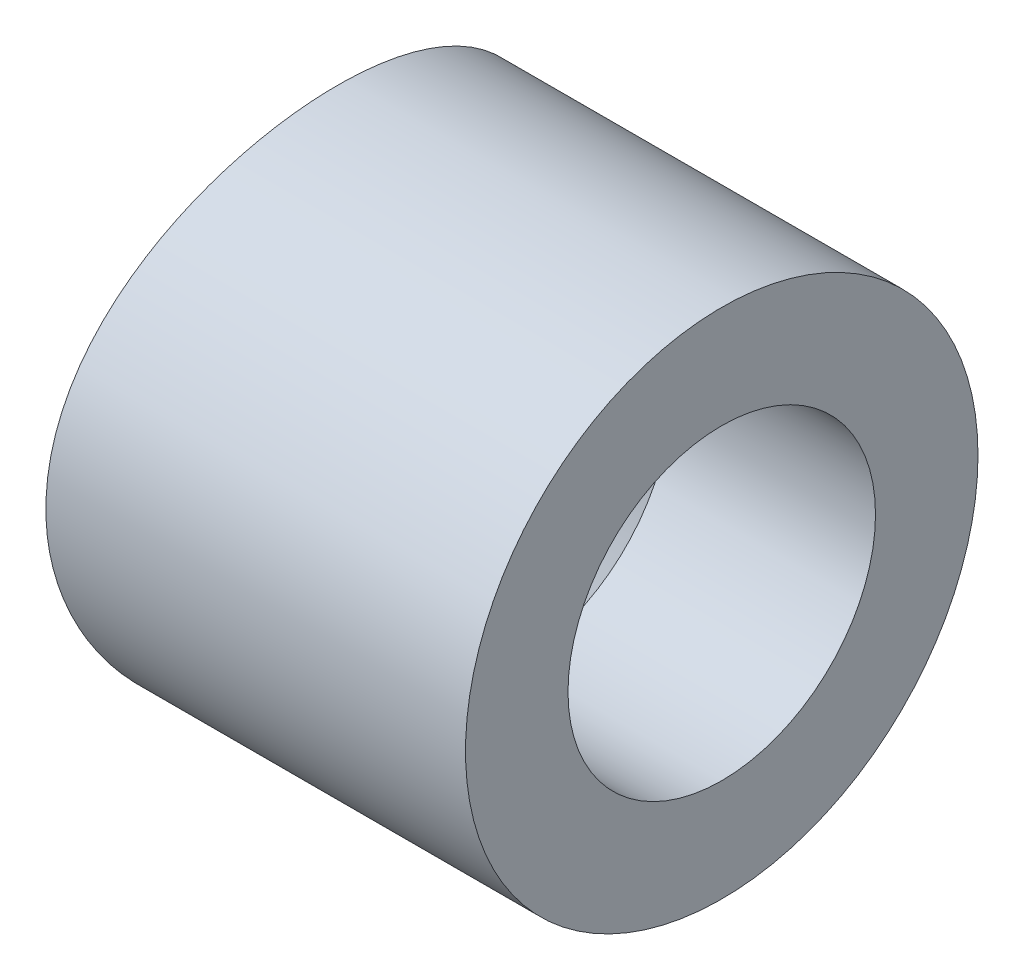
ISO-10303-21;
HEADER;
FILE_DESCRIPTION(('STEP AP214'),'2;1');
FILE_NAME('part.step','',(''),(''),'','','');
FILE_SCHEMA(('AUTOMOTIVE_DESIGN { 1 0 10303 214 1 1 1 1 }'));
ENDSEC;
DATA;
#1=APPLICATION_CONTEXT('core data for automotive mechanical design processes');
#2=APPLICATION_PROTOCOL_DEFINITION('international standard','automotive_design',2000,#1);
#3=PRODUCT_CONTEXT('',#1,'mechanical');
#4=PRODUCT('Part','Part','',(#3));
#5=PRODUCT_RELATED_PRODUCT_CATEGORY('part','',(#4));
#6=PRODUCT_DEFINITION_FORMATION('','',#4);
#7=PRODUCT_DEFINITION_CONTEXT('part definition',#1,'design');
#8=PRODUCT_DEFINITION('design','',#6,#7);
#9=PRODUCT_DEFINITION_SHAPE('','',#8);
#10=(LENGTH_UNIT() NAMED_UNIT(*) SI_UNIT(.MILLI.,.METRE.));
#11=(NAMED_UNIT(*) PLANE_ANGLE_UNIT() SI_UNIT($,.RADIAN.));
#12=(NAMED_UNIT(*) SI_UNIT($,.STERADIAN.) SOLID_ANGLE_UNIT());
#13=UNCERTAINTY_MEASURE_WITH_UNIT(LENGTH_MEASURE(1.E-05),#10,'distance_accuracy_value','');
#14=(GEOMETRIC_REPRESENTATION_CONTEXT(3) GLOBAL_UNCERTAINTY_ASSIGNED_CONTEXT((#13)) GLOBAL_UNIT_ASSIGNED_CONTEXT((#10,
#11,#12)) REPRESENTATION_CONTEXT('',''));
#15=CARTESIAN_POINT('',(0.,0.,0.));
#16=DIRECTION('',(0.,0.,1.));
#17=DIRECTION('',(1.,0.,0.));
#18=AXIS2_PLACEMENT_3D('',#15,#16,#17);
#19=CARTESIAN_POINT('',(-23.496,37.084,0.));
#20=DIRECTION('',(1.,0.,0.));
#21=DIRECTION('',(0.,0.,-1.));
#22=AXIS2_PLACEMENT_3D('',#19,#20,#21);
#23=CYLINDRICAL_SURFACE('',#22,6.35);
#24=CARTESIAN_POINT('',(33.02,37.084,0.));
#25=DIRECTION('',(1.,0.,0.));
#26=DIRECTION('',(0.,0.,-1.));
#27=AXIS2_PLACEMENT_3D('',#24,#25,#26);
#28=CIRCLE('',#27,6.35);
#29=CARTESIAN_POINT('',(33.02,37.084,-6.35));
#30=VERTEX_POINT('',#29);
#31=EDGE_CURVE('E50',#30,#30,#28,.T.);
#32=ORIENTED_EDGE('',*,*,#31,.F.);
#33=EDGE_LOOP('',(#32));
#34=FACE_BOUND('',#33,.T.);
#35=CARTESIAN_POINT('',(22.6206216758072,37.084,-6.35));
#36=CARTESIAN_POINT('',(22.6206171447665,36.9091350857843,-6.35000625183314));
#37=CARTESIAN_POINT('',(22.6226525124081,36.7343339108501,-6.34277620260016));
#38=CARTESIAN_POINT('',(22.6307205536991,36.385966778141,-6.31393451339641));
#39=CARTESIAN_POINT('',(22.6367535820083,36.2124009313415,-6.29232159742277));
#40=CARTESIAN_POINT('',(22.6526389586718,35.8677828132679,-6.23488971599179));
#41=CARTESIAN_POINT('',(22.6624921997348,35.6967311392106,-6.1990674300382));
#42=CARTESIAN_POINT('',(22.6857221381915,35.3583211202099,-6.11350973181226));
#43=CARTESIAN_POINT('',(22.6991001423121,35.1909641699923,-6.06376915922187));
#44=CARTESIAN_POINT('',(22.7289530882356,34.8614653490296,-5.95089187260937));
#45=CARTESIAN_POINT('',(22.7454223073816,34.6993144798505,-5.88777988524634));
#46=CARTESIAN_POINT('',(22.7810037447017,34.3809189100622,-5.74856966802378));
#47=CARTESIAN_POINT('',(22.8001169399521,34.2246764201898,-5.67246663490336));
#48=CARTESIAN_POINT('',(22.8404359088864,33.9192083478952,-5.50787484804411));
#49=CARTESIAN_POINT('',(22.8616410174571,33.7699805573232,-5.41939002731091));
#50=CARTESIAN_POINT('',(22.9055734442173,33.4793620884262,-5.23059496890694));
#51=CARTESIAN_POINT('',(22.9283013352139,33.3379743961835,-5.13028027042319));
#52=CARTESIAN_POINT('',(22.9751902852028,33.0608266348819,-4.91609036852589));
#53=CARTESIAN_POINT('',(22.9993722290803,32.9252690933813,-4.80195759900939));
#54=CARTESIAN_POINT('',(23.04801988654,32.6641400751404,-4.56275165173534));
#55=CARTESIAN_POINT('',(23.0724857021796,32.5385723259584,-4.43767442641537));
#56=CARTESIAN_POINT('',(23.1210162383246,32.2983226211764,-4.17745636161245));
#57=CARTESIAN_POINT('',(23.1450810604961,32.1836378706331,-4.04231812196956));
#58=CARTESIAN_POINT('',(23.1921697595213,31.9658435981473,-3.76276268759905));
#59=CARTESIAN_POINT('',(23.2151932496691,31.8627383555944,-3.61834209323056));
#60=CARTESIAN_POINT('',(23.2599258271824,31.667282714613,-3.3187619604962));
#61=CARTESIAN_POINT('',(23.281607256166,31.5751358104311,-3.16346540886465));
#62=CARTESIAN_POINT('',(23.3226233524335,31.4042891856671,-2.84534390597261));
#63=CARTESIAN_POINT('',(23.3419580147118,31.3255894937676,-2.68251893865507));
#64=CARTESIAN_POINT('',(23.3777254753196,31.1822764857297,-2.35049950220789));
#65=CARTESIAN_POINT('',(23.3941586781444,31.1176612057755,-2.18130592492826));
#66=CARTESIAN_POINT('',(23.4236510412526,31.0030483552305,-1.8377478291965));
#67=CARTESIAN_POINT('',(23.4367102157954,30.9530507228618,-1.66338333260143));
#68=CARTESIAN_POINT('',(23.4588093016421,30.8691138769165,-1.31493269979184));
#69=CARTESIAN_POINT('',(23.4679364534586,30.834824902674,-1.14093631433375));
#70=CARTESIAN_POINT('',(23.4823514106066,30.7809071541106,-0.790531904885671));
#71=CARTESIAN_POINT('',(23.4876393360399,30.7612779211911,-0.614123956512077));
#72=CARTESIAN_POINT('',(23.4942252191217,30.736856370076,-0.260234621725184));
#73=CARTESIAN_POINT('',(23.4955237400356,30.7320619573465,-0.0827533903948831));
#74=CARTESIAN_POINT('',(23.4940952959307,30.7373476820962,0.271969813521479));
#75=CARTESIAN_POINT('',(23.4913683849501,30.7474276198993,0.449211789287382));
#76=CARTESIAN_POINT('',(23.4820900623918,30.7819134780304,0.797512944806933));
#77=CARTESIAN_POINT('',(23.475640391305,30.8059383861873,0.968612707411062));
#78=CARTESIAN_POINT('',(23.4591690532612,30.8678134332904,1.30817503191727));
#79=CARTESIAN_POINT('',(23.4491461832945,30.9056682285319,1.47663668566684));
#80=CARTESIAN_POINT('',(23.4257975849334,30.994884878971,1.80966012873609));
#81=CARTESIAN_POINT('',(23.4124729269454,31.0462423570632,1.97422316304331));
#82=CARTESIAN_POINT('',(23.382875248232,31.1620540169932,2.29842112552168));
#83=CARTESIAN_POINT('',(23.3666011190504,31.2265131237326,2.45805417444132));
#84=CARTESIAN_POINT('',(23.3136242170923,31.4402532578568,2.93101382941278));
#85=CARTESIAN_POINT('',(23.2729922155807,31.6090756866499,3.23534384085546));
#86=CARTESIAN_POINT('',(23.1855836987682,31.9934533857542,3.81169980654757));
#87=CARTESIAN_POINT('',(23.1388059584488,32.2090179786794,4.08371929976479));
#88=CARTESIAN_POINT('',(23.042416504419,32.6888549836736,4.59699829564012));
#89=CARTESIAN_POINT('',(22.9927619371408,32.9544482251612,4.83701836482751));
#90=CARTESIAN_POINT('',(22.8975450373185,33.5226367341493,5.26940661322532));
#91=CARTESIAN_POINT('',(22.8519829686413,33.8252343845709,5.46177172124997));
#92=CARTESIAN_POINT('',(22.7699315305126,34.4615254462129,5.79438303780041));
#93=CARTESIAN_POINT('',(22.733502900187,34.7954077498074,5.93428324132677));
#94=CARTESIAN_POINT('',(22.6746013096901,35.4833984759042,6.15555430640536));
#95=CARTESIAN_POINT('',(22.6521247801952,35.8375017000155,6.23694013835529));
#96=CARTESIAN_POINT('',(22.6312203075726,36.369759207795,6.3121591421817));
#97=CARTESIAN_POINT('',(22.6263688748414,36.5446509016681,6.32949556878163));
#98=CARTESIAN_POINT('',(22.620731894457,36.8953188047965,6.34962001312429));
#99=CARTESIAN_POINT('',(22.6199447976745,37.0710946514808,6.35241357391038));
#100=CARTESIAN_POINT('',(22.622468337673,37.4222456562169,6.34341856455059));
#101=CARTESIAN_POINT('',(22.6257793475858,37.597620776326,6.33162866658364));
#102=CARTESIAN_POINT('',(22.6363933264572,37.9466695901215,6.29357726550313));
#103=CARTESIAN_POINT('',(22.6436961839065,38.120343331197,6.2673161666323));
#104=CARTESIAN_POINT('',(22.6618853956957,38.4612916112609,6.20121936943715));
#105=CARTESIAN_POINT('',(22.6726974643518,38.6286247068848,6.16166451508441));
#106=CARTESIAN_POINT('',(22.6976235186319,38.9593060074918,6.06920110877371));
#107=CARTESIAN_POINT('',(22.7117375093495,39.1226542063271,6.01629253621541));
#108=CARTESIAN_POINT('',(22.7428680709748,39.444330712719,5.89752010648172));
#109=CARTESIAN_POINT('',(22.7598854028959,39.6026576911947,5.83165285192726));
#110=CARTESIAN_POINT('',(22.7963388161685,39.9131890806151,5.68748491560442));
#111=CARTESIAN_POINT('',(22.8157741193291,40.0653954406364,5.60918823184984));
#112=CARTESIAN_POINT('',(22.857005031795,40.366203112449,5.43876851988416));
#113=CARTESIAN_POINT('',(22.8788444154387,40.5146426577641,5.34637051707005));
#114=CARTESIAN_POINT('',(22.9238904168971,40.803211754628,5.14979935026711));
#115=CARTESIAN_POINT('',(22.9470965809447,40.9433440335074,5.04563008387021));
#116=CARTESIAN_POINT('',(22.9942638400063,41.2145556727926,4.82612268304971));
#117=CARTESIAN_POINT('',(23.0182253212322,41.3456302887622,4.71077877015227));
#118=CARTESIAN_POINT('',(23.0662411360025,41.59778700309,4.46974688782577));
#119=CARTESIAN_POINT('',(23.0902954347047,41.718872529303,4.34406249665366));
#120=CARTESIAN_POINT('',(23.1385871155354,41.9538365013985,4.07915149182562));
#121=CARTESIAN_POINT('',(23.1628080709962,42.0673866607551,3.93963045118928));
#122=CARTESIAN_POINT('',(23.2099936243766,42.282294785638,3.65137494521792));
#123=CARTESIAN_POINT('',(23.2329586768484,42.3836571784516,3.50264385541985));
#124=CARTESIAN_POINT('',(23.2770062278525,42.573538130596,3.19685348297435));
#125=CARTESIAN_POINT('',(23.2980880471326,42.6620520628281,3.03979122770194));
#126=CARTESIAN_POINT('',(23.3377560116118,42.8254819854022,2.7185200644485));
#127=CARTESIAN_POINT('',(23.3563431701003,42.9004035011322,2.55431409423136));
#128=CARTESIAN_POINT('',(23.3903775359223,43.0355953499237,2.22106073559973));
#129=CARTESIAN_POINT('',(23.4058465481623,43.0959680475071,2.05205712194958));
#130=CARTESIAN_POINT('',(23.4333665339019,43.2022331934042,1.70935456263783));
#131=CARTESIAN_POINT('',(23.445418835247,43.2481312678107,1.53565746984064));
#132=CARTESIAN_POINT('',(23.4657662991011,43.3250769404406,1.18478538212078));
#133=CARTESIAN_POINT('',(23.4740614471594,43.356124481546,1.00761037382413));
#134=CARTESIAN_POINT('',(23.4866528998132,43.4030864204215,0.651126501720603));
#135=CARTESIAN_POINT('',(23.4909493092125,43.419001214809,0.471817693963652));
#136=CARTESIAN_POINT('',(23.4953473733548,43.4352896600527,0.118145175763382));
#137=CARTESIAN_POINT('',(23.495577649598,43.4361398435959,-0.0561951656149366));
#138=CARTESIAN_POINT('',(23.4921651300471,43.4235058939125,-0.404378907100561));
#139=CARTESIAN_POINT('',(23.488521001593,43.4100168284852,-0.578222115582204));
#140=CARTESIAN_POINT('',(23.4774599735417,43.3688225152545,-0.924019892520089));
#141=CARTESIAN_POINT('',(23.4700446248609,43.3411231114195,-1.09597520769914));
#142=CARTESIAN_POINT('',(23.4516411147444,43.2717349691396,-1.43690997705177));
#143=CARTESIAN_POINT('',(23.4406516253533,43.2300410309055,-1.60588830050033));
#144=CARTESIAN_POINT('',(23.4154948510946,43.1333828153089,-1.9383519498607));
#145=CARTESIAN_POINT('',(23.4013524801819,43.0785223326594,-2.10186937398204));
#146=CARTESIAN_POINT('',(23.3702108552296,42.9557760302198,-2.4237204402937));
#147=CARTESIAN_POINT('',(23.3532106269032,42.8878857672592,-2.58205229257541));
#148=CARTESIAN_POINT('',(23.316801082755,42.7396034428921,-2.8924437612224));
#149=CARTESIAN_POINT('',(23.2973919379499,42.6592122688631,-3.04450382182238));
#150=CARTESIAN_POINT('',(23.2566636402634,42.4864919892186,-3.34141891668782));
#151=CARTESIAN_POINT('',(23.2353444282769,42.3941625141451,-3.4862737277782));
#152=CARTESIAN_POINT('',(23.1907377513563,42.195498258849,-3.77175691494927));
#153=CARTESIAN_POINT('',(23.1674123477824,42.0888488925914,-3.91216052064368));
#154=CARTESIAN_POINT('',(23.119956008435,41.8643628754884,-4.18349452734483));
#155=CARTESIAN_POINT('',(23.0958253267365,41.7465297320221,-4.31442787579868));
#156=CARTESIAN_POINT('',(23.0473864352661,41.500340886817,-4.56611874572125));
#157=CARTESIAN_POINT('',(23.0230781278546,41.3719789272514,-4.68687012778365));
#158=CARTESIAN_POINT('',(22.9749675249348,41.105660287482,-4.9172902271998));
#159=CARTESIAN_POINT('',(22.9511650516392,40.9677070536903,-5.02696289105302));
#160=CARTESIAN_POINT('',(22.9041732405695,40.6797287642355,-5.23695723714319));
#161=CARTESIAN_POINT('',(22.8810109256175,40.5294979383936,-5.33700305876006));
#162=CARTESIAN_POINT('',(22.8365819135332,40.2209176521177,-5.5240192225743));
#163=CARTESIAN_POINT('',(22.8153145234116,40.0625711932848,-5.61099435288564));
#164=CARTESIAN_POINT('',(22.7753128994162,39.7388299842419,-5.77121945576788));
#165=CARTESIAN_POINT('',(22.7565777660707,39.5734377643252,-5.8444743054439));
#166=CARTESIAN_POINT('',(22.7222115848837,39.2367794660244,-5.97668550141194));
#167=CARTESIAN_POINT('',(22.7065801261453,39.065514168705,-6.03564374066746));
#168=CARTESIAN_POINT('',(22.6694728834058,38.5996019960367,-6.17399909986717));
#169=CARTESIAN_POINT('',(22.6512928492117,38.3005469476815,-6.2398699648559));
#170=CARTESIAN_POINT('',(22.626871930229,37.6955957757883,-6.32786229638115));
#171=CARTESIAN_POINT('',(22.6206295970153,37.3897004867475,-6.34998907048653));
#172=CARTESIAN_POINT('',(22.6206216758072,37.084,-6.35));
#173=B_SPLINE_CURVE_WITH_KNOTS('',3,(#35,#36,#37,#38,#39,#40,#41,#42,#43,#44,#45,#46,#47,#48,
#49,#50,#51,#52,#53,#54,#55,#56,#57,#58,#59,#60,#61,#62,#63,#64,#65,#66,#67,#68,#69,#70,#71,#72,
#73,#74,#75,#76,#77,#78,#79,#80,#81,#82,#83,#84,#85,#86,#87,#88,#89,#90,#91,#92,#93,#94,#95,#96,
#97,#98,#99,#100,#101,#102,#103,#104,#105,#106,#107,#108,#109,#110,#111,#112,#113,#114,#115,
#116,#117,#118,#119,#120,#121,#122,#123,#124,#125,#126,#127,#128,#129,#130,#131,#132,#133,#134,
#135,#136,#137,#138,#139,#140,#141,#142,#143,#144,#145,#146,#147,#148,#149,#150,#151,#152,#153,
#154,#155,#156,#157,#158,#159,#160,#161,#162,#163,#164,#165,#166,#167,#168,#169,#170,#171,#172),
.UNSPECIFIED.,.T.,.F.,(4,2,2,2,2,2,2,2,2,2,2,2,2,2,2,2,2,2,2,2,2,2,2,2,2,2,2,2,2,2,2,2,2,2,2,2,
2,2,2,2,2,2,2,2,2,2,2,2,2,2,2,2,2,2,2,2,2,2,2,2,2,2,2,2,2,2,2,2,4),(0.,0.524323954257934,
1.04869443109725,1.57318751695724,2.09787532114586,2.62160120221926,3.14552114483723,
3.66927504340258,4.1932270745449,4.72915637910556,5.26528472968704,5.80127501843049,
6.33746274349253,6.88242056114094,7.42737954116064,7.97226248785955,8.51714313171064,
9.04921911951586,9.58127846176817,10.1132626789349,10.6452397547088,11.1633237230556,
11.6815822827336,12.1996730475094,12.7179589239508,13.7639356736812,14.8101212332043,
15.8892743584984,16.9684970131334,18.0547169244142,19.1406588367074,19.6675750785031,
20.1942904703721,20.7210538231052,21.2478024618239,21.7640576415664,22.2803136177241,
22.7967051215616,23.3129308597262,23.8409484822109,24.3687917818554,24.8969095041714,
25.4248452372176,25.9687318221743,26.5124202359744,27.0563039643487,27.5999661033359,
28.1396834248946,28.6791907062397,29.2187000626113,29.7581952784755,30.2805932829465,
30.8031710322386,31.3255340447225,31.848091360907,32.3666572536204,32.8854002931198,
33.404106526425,33.9228288161238,34.4557732571606,34.9885511086582,35.521647944915,
36.054554204889,36.5998197428643,37.1448850472694,37.6897562297636,38.234555228355,
39.1512945306582,40.0679225960937),.UNSPECIFIED.);
#174=CARTESIAN_POINT('',(22.6206216758072,37.084,-6.35));
#175=VERTEX_POINT('',#174);
#176=EDGE_CURVE('E64',#175,#175,#173,.T.);
#177=ORIENTED_EDGE('',*,*,#176,.F.);
#178=EDGE_LOOP('',(#177));
#179=FACE_BOUND('',#178,.T.);
#180=ADVANCED_FACE('F38',(#34,#179),#23,.T.);
#181=CARTESIAN_POINT('',(33.02,37.084,0.));
#182=DIRECTION('',(1.,0.,0.));
#183=DIRECTION('',(0.,0.,-1.));
#184=AXIS2_PLACEMENT_3D('',#181,#182,#183);
#185=PLANE('',#184);
#186=CARTESIAN_POINT('',(33.02,37.084,0.));
#187=DIRECTION('',(1.,0.,0.));
#188=DIRECTION('',(0.,0.,-1.));
#189=AXIS2_PLACEMENT_3D('',#186,#187,#188);
#190=CIRCLE('',#189,3.81);
#191=CARTESIAN_POINT('',(33.02,37.084,-3.81));
#192=VERTEX_POINT('',#191);
#193=EDGE_CURVE('E54',#192,#192,#190,.T.);
#194=ORIENTED_EDGE('',*,*,#193,.F.);
#195=EDGE_LOOP('',(#194));
#196=FACE_BOUND('',#195,.T.);
#197=ORIENTED_EDGE('',*,*,#31,.T.);
#198=EDGE_LOOP('',(#197));
#199=FACE_BOUND('',#198,.T.);
#200=ADVANCED_FACE('F84',(#196,#199),#185,.T.);
#201=CARTESIAN_POINT('',(-23.496,37.084,0.));
#202=DIRECTION('',(1.,0.,0.));
#203=DIRECTION('',(0.,0.,-1.));
#204=AXIS2_PLACEMENT_3D('',#201,#202,#203);
#205=CYLINDRICAL_SURFACE('',#204,3.81);
#206=CARTESIAN_POINT('',(27.94,37.084,0.));
#207=DIRECTION('',(1.,0.,0.));
#208=DIRECTION('',(0.,0.,-1.));
#209=AXIS2_PLACEMENT_3D('',#206,#207,#208);
#210=CIRCLE('',#209,3.81);
#211=CARTESIAN_POINT('',(27.94,37.084,-3.81));
#212=VERTEX_POINT('',#211);
#213=EDGE_CURVE('E46',#212,#212,#210,.F.);
#214=CARTESIAN_POINT('',(27.94,37.084,-3.81));
#215=CARTESIAN_POINT('',(27.9929166666667,37.084,-3.81));
#216=CARTESIAN_POINT('',(28.0458333333333,37.084,-3.81));
#217=CARTESIAN_POINT('',(28.1516666666667,37.084,-3.81));
#218=CARTESIAN_POINT('',(28.2045833333333,37.084,-3.81));
#219=CARTESIAN_POINT('',(28.3104166666667,37.084,-3.81));
#220=CARTESIAN_POINT('',(28.3633333333333,37.084,-3.81));
#221=CARTESIAN_POINT('',(28.4691666666667,37.084,-3.81));
#222=CARTESIAN_POINT('',(28.5220833333333,37.084,-3.81));
#223=CARTESIAN_POINT('',(28.6279166666667,37.084,-3.81));
#224=CARTESIAN_POINT('',(28.6808333333333,37.084,-3.81));
#225=CARTESIAN_POINT('',(28.7866666666667,37.084,-3.81));
#226=CARTESIAN_POINT('',(28.8395833333333,37.084,-3.81));
#227=CARTESIAN_POINT('',(28.9454166666667,37.084,-3.81));
#228=CARTESIAN_POINT('',(28.9983333333333,37.084,-3.81));
#229=CARTESIAN_POINT('',(29.1041666666667,37.084,-3.81));
#230=CARTESIAN_POINT('',(29.1570833333333,37.084,-3.81));
#231=CARTESIAN_POINT('',(29.2629166666667,37.084,-3.81));
#232=CARTESIAN_POINT('',(29.3158333333333,37.084,-3.81));
#233=CARTESIAN_POINT('',(29.4216666666667,37.084,-3.81));
#234=CARTESIAN_POINT('',(29.4745833333333,37.084,-3.81));
#235=CARTESIAN_POINT('',(29.5804166666667,37.084,-3.81));
#236=CARTESIAN_POINT('',(29.6333333333333,37.084,-3.81));
#237=CARTESIAN_POINT('',(29.7391666666667,37.084,-3.81));
#238=CARTESIAN_POINT('',(29.7920833333333,37.084,-3.81));
#239=CARTESIAN_POINT('',(29.8979166666667,37.084,-3.81));
#240=CARTESIAN_POINT('',(29.9508333333333,37.084,-3.81));
#241=CARTESIAN_POINT('',(30.0566666666667,37.084,-3.81));
#242=CARTESIAN_POINT('',(30.1095833333333,37.084,-3.81));
#243=CARTESIAN_POINT('',(30.2154166666667,37.084,-3.81));
#244=CARTESIAN_POINT('',(30.2683333333333,37.084,-3.81));
#245=CARTESIAN_POINT('',(30.3741666666667,37.084,-3.81));
#246=CARTESIAN_POINT('',(30.4270833333333,37.084,-3.81));
#247=CARTESIAN_POINT('',(30.5329166666667,37.084,-3.81));
#248=CARTESIAN_POINT('',(30.5858333333333,37.084,-3.81));
#249=CARTESIAN_POINT('',(30.6916666666667,37.084,-3.81));
#250=CARTESIAN_POINT('',(30.7445833333333,37.084,-3.81));
#251=CARTESIAN_POINT('',(30.8504166666667,37.084,-3.81));
#252=CARTESIAN_POINT('',(30.9033333333333,37.084,-3.81));
#253=CARTESIAN_POINT('',(31.0091666666667,37.084,-3.81));
#254=CARTESIAN_POINT('',(31.0620833333333,37.084,-3.81));
#255=CARTESIAN_POINT('',(31.1679166666667,37.084,-3.81));
#256=CARTESIAN_POINT('',(31.2208333333333,37.084,-3.81));
#257=CARTESIAN_POINT('',(31.3266666666667,37.084,-3.81));
#258=CARTESIAN_POINT('',(31.3795833333333,37.084,-3.81));
#259=CARTESIAN_POINT('',(31.4854166666667,37.084,-3.81));
#260=CARTESIAN_POINT('',(31.5383333333333,37.084,-3.81));
#261=CARTESIAN_POINT('',(31.6441666666667,37.084,-3.81));
#262=CARTESIAN_POINT('',(31.6970833333333,37.084,-3.81));
#263=CARTESIAN_POINT('',(31.8029166666667,37.084,-3.81));
#264=CARTESIAN_POINT('',(31.8558333333333,37.084,-3.81));
#265=CARTESIAN_POINT('',(31.9616666666667,37.084,-3.81));
#266=CARTESIAN_POINT('',(32.0145833333333,37.084,-3.81));
#267=CARTESIAN_POINT('',(32.1204166666667,37.084,-3.81));
#268=CARTESIAN_POINT('',(32.1733333333333,37.084,-3.81));
#269=CARTESIAN_POINT('',(32.2791666666667,37.084,-3.81));
#270=CARTESIAN_POINT('',(32.3320833333333,37.084,-3.81));
#271=CARTESIAN_POINT('',(32.4379166666667,37.084,-3.81));
#272=CARTESIAN_POINT('',(32.4908333333333,37.084,-3.81));
#273=CARTESIAN_POINT('',(32.5966666666667,37.084,-3.81));
#274=CARTESIAN_POINT('',(32.6495833333333,37.084,-3.81));
#275=CARTESIAN_POINT('',(32.7554166666667,37.084,-3.81));
#276=CARTESIAN_POINT('',(32.8083333333333,37.084,-3.81));
#277=CARTESIAN_POINT('',(32.9141666666667,37.084,-3.81));
#278=CARTESIAN_POINT('',(32.9670833333333,37.084,-3.81));
#279=CARTESIAN_POINT('',(33.02,37.084,-3.81));
#280=B_SPLINE_CURVE_WITH_KNOTS('',3,(#214,#215,#216,#217,#218,#219,#220,#221,#222,#223,#224,
#225,#226,#227,#228,#229,#230,#231,#232,#233,#234,#235,#236,#237,#238,#239,#240,#241,#242,#243,
#244,#245,#246,#247,#248,#249,#250,#251,#252,#253,#254,#255,#256,#257,#258,#259,#260,#261,#262,
#263,#264,#265,#266,#267,#268,#269,#270,#271,#272,#273,#274,#275,#276,#277,#278,#279),
.UNSPECIFIED.,.F.,.F.,(4,2,2,2,2,2,2,2,2,2,2,2,2,2,2,2,2,2,2,2,2,2,2,2,2,2,2,2,2,2,2,2,4),(0.,
0.158749999999999,0.317499999999998,0.476249999999998,0.634999999999997,0.793750000000003,
0.952500000000002,1.11125,1.27,1.42875,1.5875,1.74625,1.905,2.06375,2.2225,2.38125,2.54,2.69875,
2.8575,3.01625,3.175,3.33375,3.4925,3.65125,3.81,3.96875,4.1275,4.28625,4.445,4.60375,4.7625,
4.92125,5.08),.UNSPECIFIED.);
#281=EDGE_CURVE('BSEAM80',#212,#192,#280,.T.);
#282=ORIENTED_EDGE('',*,*,#213,.T.);
#283=ORIENTED_EDGE('',*,*,#193,.T.);
#284=ORIENTED_EDGE('',*,*,#281,.T.);
#285=ORIENTED_EDGE('',*,*,#281,.F.);
#286=EDGE_LOOP('',(#282,#284,#283,#285));
#287=FACE_BOUND('',#286,.T.);
#288=ADVANCED_FACE('F80',(#287),#205,.F.);
#289=CARTESIAN_POINT('',(0.,-21.59,0.));
#290=DIRECTION('',(0.,1.,0.));
#291=DIRECTION('',(0.,0.,1.));
#292=AXIS2_PLACEMENT_3D('',#289,#290,#291);
#293=CYLINDRICAL_SURFACE('',#292,23.495);
#294=CARTESIAN_POINT('',(23.4671808277006,37.084,-1.143));
#295=CARTESIAN_POINT('',(23.4671812015423,37.1481620408257,-1.14299716751597));
#296=CARTESIAN_POINT('',(23.4674467957557,37.2123696381507,-1.13757927340977));
#297=CARTESIAN_POINT('',(23.468480667282,37.3390137247063,-1.11604296938429));
#298=CARTESIAN_POINT('',(23.4692495375468,37.40144803403,-1.09991193708331));
#299=CARTESIAN_POINT('',(23.4712026622397,37.5226926412436,-1.05741216515425));
#300=CARTESIAN_POINT('',(23.4723867055981,37.5815047627886,-1.03104862690017));
#301=CARTESIAN_POINT('',(23.4750364919058,37.6938528500242,-0.968840149316962));
#302=CARTESIAN_POINT('',(23.4765021681495,37.7473900605621,-0.93299745440364));
#303=CARTESIAN_POINT('',(23.4795516869506,37.847736301247,-0.852809464043885));
#304=CARTESIAN_POINT('',(23.4811356282184,37.8945396133716,-0.80845701632321));
#305=CARTESIAN_POINT('',(23.4842422642483,37.9800407623088,-0.71252274072671));
#306=CARTESIAN_POINT('',(23.4857649565135,38.0187382689457,-0.660940618505534));
#307=CARTESIAN_POINT('',(23.4885782468792,38.0869447274836,-0.551981722878822));
#308=CARTESIAN_POINT('',(23.4898687336854,38.1164492781982,-0.494602191281536));
#309=CARTESIAN_POINT('',(23.4920711989838,38.1654040365023,-0.375696702162708));
#310=CARTESIAN_POINT('',(23.492983180228,38.1848543171965,-0.314170774793358));
#311=CARTESIAN_POINT('',(23.4943252068262,38.2131334533721,-0.188771116245216));
#312=CARTESIAN_POINT('',(23.494755636832,38.2219707866443,-0.124899301092025));
#313=CARTESIAN_POINT('',(23.4950873444214,38.2287993294257,0.00342256595986923));
#314=CARTESIAN_POINT('',(23.4949886259981,38.226790620785,0.0678726134912505));
#315=CARTESIAN_POINT('',(23.4942734857641,38.2119911410647,0.195464039725268));
#316=CARTESIAN_POINT('',(23.4936575021562,38.1992094962792,0.258606479793228));
#317=CARTESIAN_POINT('',(23.4919777226599,38.1632411135463,0.381848453076381));
#318=CARTESIAN_POINT('',(23.4909139249679,38.1400543336876,0.441947974033754));
#319=CARTESIAN_POINT('',(23.4884575978398,38.0839234567575,0.557427493929315));
#320=CARTESIAN_POINT('',(23.4870649282945,38.0509751994753,0.612805467622222));
#321=CARTESIAN_POINT('',(23.484107703139,37.9762596888124,0.717247775738596));
#322=CARTESIAN_POINT('',(23.4825431463834,37.93449237666,0.766312068083102));
#323=CARTESIAN_POINT('',(23.4794164364957,37.8432727788302,0.85678748170384));
#324=CARTESIAN_POINT('',(23.4778542875337,37.7938125753973,0.898190620663282));
#325=CARTESIAN_POINT('',(23.4749101356674,37.6886390123381,0.97210695552611));
#326=CARTESIAN_POINT('',(23.4735281328091,37.6329256511154,1.00462014915999));
#327=CARTESIAN_POINT('',(23.4711002435117,37.5168224788162,1.05983295260262));
#328=CARTESIAN_POINT('',(23.4700543672358,37.4564325264071,1.08253226568676));
#329=CARTESIAN_POINT('',(23.4684170651529,37.3326925843023,1.1174676426876));
#330=CARTESIAN_POINT('',(23.4678256361103,37.269342615686,1.12970378110508));
#331=CARTESIAN_POINT('',(23.4671645208174,37.1415504415594,1.14335560374227));
#332=CARTESIAN_POINT('',(23.4670943004332,37.0771094220761,1.14478236542737));
#333=CARTESIAN_POINT('',(23.467482126757,36.9489032786006,1.13680383869269));
#334=CARTESIAN_POINT('',(23.4679401718127,36.8851381524952,1.12739858415129));
#335=CARTESIAN_POINT('',(23.4693324147242,36.7601249523743,1.09803219198458));
#336=CARTESIAN_POINT('',(23.4702663839971,36.6988756852567,1.07807612166588));
#337=CARTESIAN_POINT('',(23.4725050125936,36.5805961006155,1.02817970626659));
#338=CARTESIAN_POINT('',(23.4738096739464,36.523565806189,0.998239306531278));
#339=CARTESIAN_POINT('',(23.4766439376002,36.4152920786291,0.929195689368791));
#340=CARTESIAN_POINT('',(23.478173722237,36.3640533963854,0.890085029221658));
#341=CARTESIAN_POINT('',(23.4812851657953,36.2688651551084,0.803821977214313));
#342=CARTESIAN_POINT('',(23.4828668250317,36.2249156403392,0.75666953652325));
#343=CARTESIAN_POINT('',(23.4859053077114,36.1455160948234,0.655613840164298));
#344=CARTESIAN_POINT('',(23.4873620254197,36.1100732183052,0.601704959805408));
#345=CARTESIAN_POINT('',(23.4899849377064,36.0487419488594,0.488695107832374));
#346=CARTESIAN_POINT('',(23.4911511334988,36.0228535160061,0.429594157916018));
#347=CARTESIAN_POINT('',(23.493061063559,35.9813785261172,0.307904469407954));
#348=CARTESIAN_POINT('',(23.493804985687,35.9657873875363,0.245317295390669));
#349=CARTESIAN_POINT('',(23.4947872741423,35.9453345563208,0.118409854683554));
#350=CARTESIAN_POINT('',(23.4950256431211,35.9404728074138,0.0540895970850259));
#351=CARTESIAN_POINT('',(23.4949699731054,35.9416173051945,-0.0743871598360166));
#352=CARTESIAN_POINT('',(23.4946764840107,35.9476123268237,-0.138543759695639));
#353=CARTESIAN_POINT('',(23.4935912226766,35.9702769925359,-0.26493848882122));
#354=CARTESIAN_POINT('',(23.4927994494936,35.9869466568316,-0.327176614454245));
#355=CARTESIAN_POINT('',(23.4908067078097,36.0304851520761,-0.447970117115397));
#356=CARTESIAN_POINT('',(23.4896057358657,36.0573540688446,-0.506525463150603));
#357=CARTESIAN_POINT('',(23.4869296830157,36.1205263469347,-0.618294540452899));
#358=CARTESIAN_POINT('',(23.4854546106488,36.156829414368,-0.671508438042733));
#359=CARTESIAN_POINT('',(23.4823946642246,36.2378794363543,-0.771139995840972));
#360=CARTESIAN_POINT('',(23.4808096899108,36.282634166678,-0.817551327095922));
#361=CARTESIAN_POINT('',(23.477709232809,36.3793129085155,-0.902216269880394));
#362=CARTESIAN_POINT('',(23.4761937672235,36.4312386821543,-0.940467870439921));
#363=CARTESIAN_POINT('',(23.4734022747429,36.5408246545268,-1.00774451641284));
#364=CARTESIAN_POINT('',(23.4721264726888,36.5984901611981,-1.03676091533692));
#365=CARTESIAN_POINT('',(23.4699617857116,36.7178373343222,-1.08466548250831));
#366=CARTESIAN_POINT('',(23.4690724436402,36.7795141558565,-1.10356562357528));
#367=CARTESIAN_POINT('',(23.4680166298507,36.8819789357885,-1.12573932790774));
#368=CARTESIAN_POINT('',(23.467704584603,36.922103086418,-1.13220382608));
#369=CARTESIAN_POINT('',(23.4672865653239,37.002812077059,-1.14083505661703));
#370=CARTESIAN_POINT('',(23.4671805911258,37.0433969166982,-1.14300179245522));
#371=CARTESIAN_POINT('',(23.4671808277006,37.084,-1.143));
#372=B_SPLINE_CURVE_WITH_KNOTS('',3,(#294,#295,#296,#297,#298,#299,#300,#301,#302,#303,#304,
#305,#306,#307,#308,#309,#310,#311,#312,#313,#314,#315,#316,#317,#318,#319,#320,#321,#322,#323,
#324,#325,#326,#327,#328,#329,#330,#331,#332,#333,#334,#335,#336,#337,#338,#339,#340,#341,#342,
#343,#344,#345,#346,#347,#348,#349,#350,#351,#352,#353,#354,#355,#356,#357,#358,#359,#360,#361,
#362,#363,#364,#365,#366,#367,#368,#369,#370,#371),.UNSPECIFIED.,.T.,.F.,(4,2,2,2,2,2,2,2,2,2,2,
2,2,2,2,2,2,2,2,2,2,2,2,2,2,2,2,2,2,2,2,2,2,2,2,2,2,2,4),(0.,0.192337906452798,
0.384902831326981,0.57736999977654,0.769791637782265,0.962375716380089,1.15496763802856,
1.34765162311327,1.54033420716973,1.73286277071825,1.92538988134312,2.11775405634727,
2.31011900619213,2.50256605762573,2.69501439159985,2.88766212614614,3.08030990987325,
3.27296351793681,3.46561575424024,3.65807053350427,3.85052471084556,4.04288654086243,
4.23524942389464,4.42776897526055,4.62028969567451,4.81297176635927,5.00565303185913,
5.19824851038503,5.39084297880208,5.58323843315496,5.77563425181647,5.96803168939396,
6.16042313421437,6.35299245469388,6.54560917929494,6.73840571506379,6.93097356438773,
7.0526891184581,7.17440457415896),.UNSPECIFIED.);
#373=CARTESIAN_POINT('',(23.4671808277006,37.084,-1.143));
#374=VERTEX_POINT('',#373);
#375=EDGE_CURVE('E57',#374,#374,#372,.T.);
#376=ORIENTED_EDGE('',*,*,#375,.T.);
#377=EDGE_LOOP('',(#376));
#378=FACE_BOUND('',#377,.T.);
#379=ORIENTED_EDGE('',*,*,#176,.T.);
#380=EDGE_LOOP('',(#379));
#381=FACE_BOUND('',#380,.T.);
#382=ADVANCED_FACE('F67',(#378,#381),#293,.F.);
#383=CARTESIAN_POINT('',(26.67,37.084,0.));
#384=DIRECTION('',(1.,0.,0.));
#385=DIRECTION('',(0.,0.,-1.));
#386=AXIS2_PLACEMENT_3D('',#383,#384,#385);
#387=PLANE('',#386);
#388=CARTESIAN_POINT('',(26.67,37.084,0.));
#389=DIRECTION('',(1.,0.,0.));
#390=DIRECTION('',(0.,0.,-1.));
#391=AXIS2_PLACEMENT_3D('',#388,#389,#390);
#392=CIRCLE('',#391,2.54000000000001);
#393=CARTESIAN_POINT('',(26.67,37.084,-2.54000000000001));
#394=VERTEX_POINT('',#393);
#395=EDGE_CURVE('E11',#394,#394,#392,.T.);
#396=ORIENTED_EDGE('',*,*,#395,.T.);
#397=EDGE_LOOP('',(#396));
#398=FACE_BOUND('',#397,.T.);
#399=CARTESIAN_POINT('',(26.67,37.084,0.));
#400=DIRECTION('',(1.,0.,0.));
#401=DIRECTION('',(0.,0.,-1.));
#402=AXIS2_PLACEMENT_3D('',#399,#400,#401);
#403=CIRCLE('',#402,1.143);
#404=CARTESIAN_POINT('',(26.67,37.084,-1.143));
#405=VERTEX_POINT('',#404);
#406=EDGE_CURVE('E65',#405,#405,#403,.T.);
#407=ORIENTED_EDGE('',*,*,#406,.F.);
#408=EDGE_LOOP('',(#407));
#409=FACE_BOUND('',#408,.T.);
#410=ADVANCED_FACE('F74',(#398,#409),#387,.T.);
#411=CARTESIAN_POINT('',(21.59,37.084,0.));
#412=DIRECTION('',(1.,0.,0.));
#413=DIRECTION('',(0.,0.,-1.));
#414=AXIS2_PLACEMENT_3D('',#411,#412,#413);
#415=CYLINDRICAL_SURFACE('',#414,1.143);
#416=ORIENTED_EDGE('',*,*,#406,.T.);
#417=EDGE_LOOP('',(#416));
#418=FACE_BOUND('',#417,.T.);
#419=ORIENTED_EDGE('',*,*,#375,.F.);
#420=EDGE_LOOP('',(#419));
#421=FACE_BOUND('',#420,.T.);
#422=ADVANCED_FACE('F71',(#418,#421),#415,.F.);
#423=CARTESIAN_POINT('',(27.94,37.084,0.));
#424=DIRECTION('',(1.,0.,0.));
#425=DIRECTION('',(0.,0.,-1.));
#426=AXIS2_PLACEMENT_3D('',#423,#424,#425);
#427=CONICAL_SURFACE('',#426,3.81,0.785398163397444);
#428=ORIENTED_EDGE('',*,*,#395,.F.);
#429=EDGE_LOOP('',(#428));
#430=FACE_BOUND('',#429,.T.);
#431=ORIENTED_EDGE('',*,*,#213,.F.);
#432=EDGE_LOOP('',(#431));
#433=FACE_BOUND('',#432,.T.);
#434=ADVANCED_FACE('F41',(#430,#433),#427,.F.);
#435=CLOSED_SHELL('',(#180,#200,#288,#382,#410,#422,#434));
#436=MANIFOLD_SOLID_BREP('B2',#435);
#437=ADVANCED_BREP_SHAPE_REPRESENTATION('',(#18,#436),#14);
#438=SHAPE_DEFINITION_REPRESENTATION(#9,#437);
ENDSEC;
END-ISO-10303-21;
